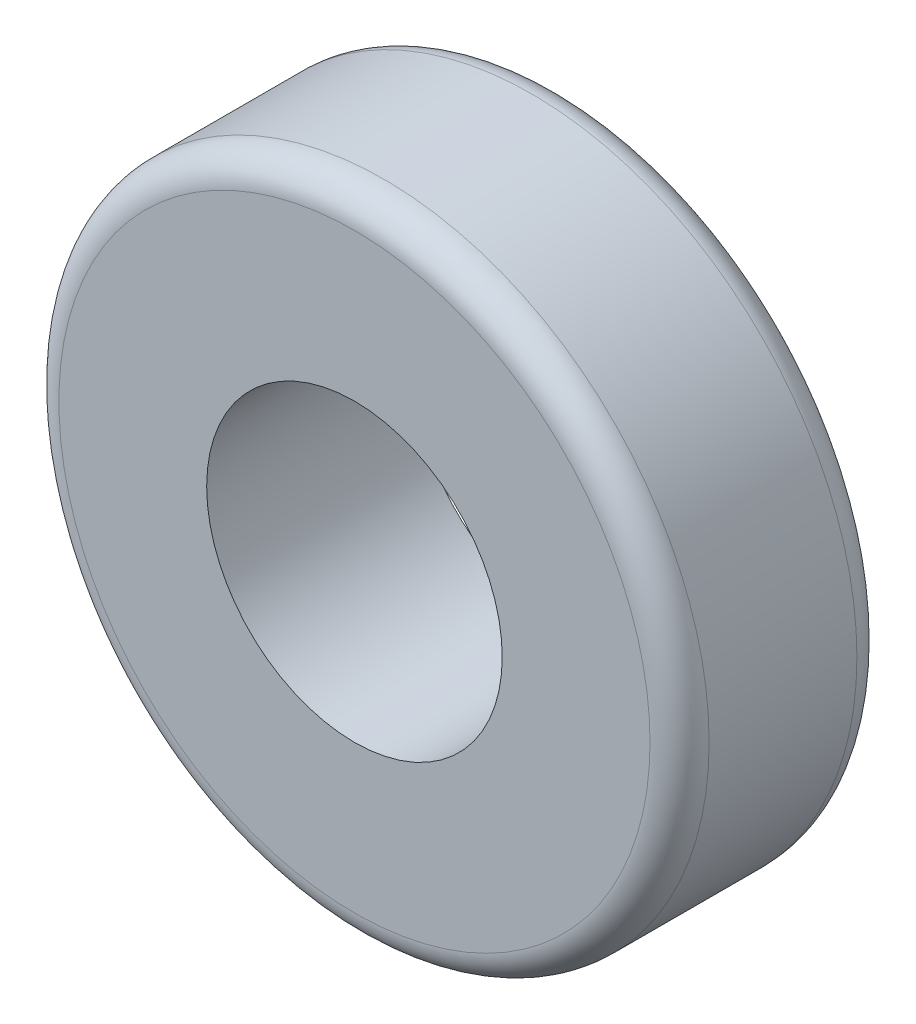
ISO-10303-21;
HEADER;
FILE_DESCRIPTION(('STEP AP214'),'2;1');
FILE_NAME('part.step','',(''),(''),'','','');
FILE_SCHEMA(('AUTOMOTIVE_DESIGN { 1 0 10303 214 1 1 1 1 }'));
ENDSEC;
DATA;
#1=APPLICATION_CONTEXT('core data for automotive mechanical design processes');
#2=APPLICATION_PROTOCOL_DEFINITION('international standard','automotive_design',2000,#1);
#3=PRODUCT_CONTEXT('',#1,'mechanical');
#4=PRODUCT('Part','Part','',(#3));
#5=PRODUCT_RELATED_PRODUCT_CATEGORY('part','',(#4));
#6=PRODUCT_DEFINITION_FORMATION('','',#4);
#7=PRODUCT_DEFINITION_CONTEXT('part definition',#1,'design');
#8=PRODUCT_DEFINITION('design','',#6,#7);
#9=PRODUCT_DEFINITION_SHAPE('','',#8);
#10=(LENGTH_UNIT() NAMED_UNIT(*) SI_UNIT(.MILLI.,.METRE.));
#11=(NAMED_UNIT(*) PLANE_ANGLE_UNIT() SI_UNIT($,.RADIAN.));
#12=(NAMED_UNIT(*) SI_UNIT($,.STERADIAN.) SOLID_ANGLE_UNIT());
#13=UNCERTAINTY_MEASURE_WITH_UNIT(LENGTH_MEASURE(1.E-05),#10,'distance_accuracy_value','');
#14=(GEOMETRIC_REPRESENTATION_CONTEXT(3) GLOBAL_UNCERTAINTY_ASSIGNED_CONTEXT((#13)) GLOBAL_UNIT_ASSIGNED_CONTEXT((#10,
#11,#12)) REPRESENTATION_CONTEXT('',''));
#15=CARTESIAN_POINT('',(0.,0.,0.));
#16=DIRECTION('',(0.,0.,1.));
#17=DIRECTION('',(1.,0.,0.));
#18=AXIS2_PLACEMENT_3D('',#15,#16,#17);
#19=CARTESIAN_POINT('',(0.,0.,7.));
#20=DIRECTION('',(0.,0.,1.));
#21=DIRECTION('',(1.,0.,0.));
#22=AXIS2_PLACEMENT_3D('',#19,#20,#21);
#23=PLANE('',#22);
#24=CARTESIAN_POINT('',(0.,0.,7.));
#25=DIRECTION('',(0.,0.,1.));
#26=DIRECTION('',(1.,0.,0.));
#27=AXIS2_PLACEMENT_3D('',#24,#25,#26);
#28=CIRCLE('',#27,10.);
#29=CARTESIAN_POINT('',(10.,0.,7.));
#30=VERTEX_POINT('',#29);
#31=EDGE_CURVE('E10',#30,#30,#28,.T.);
#32=ORIENTED_EDGE('',*,*,#31,.T.);
#33=EDGE_LOOP('',(#32));
#34=FACE_BOUND('',#33,.T.);
#35=CARTESIAN_POINT('',(0.,0.,7.));
#36=DIRECTION('',(0.,0.,1.));
#37=DIRECTION('',(1.,0.,0.));
#38=AXIS2_PLACEMENT_3D('',#35,#36,#37);
#39=CIRCLE('',#38,5.);
#40=CARTESIAN_POINT('',(5.,0.,7.));
#41=VERTEX_POINT('',#40);
#42=EDGE_CURVE('E57',#41,#41,#39,.T.);
#43=ORIENTED_EDGE('',*,*,#42,.F.);
#44=EDGE_LOOP('',(#43));
#45=FACE_BOUND('',#44,.T.);
#46=ADVANCED_FACE('F37',(#34,#45),#23,.T.);
#47=CARTESIAN_POINT('',(0.,0.,0.));
#48=DIRECTION('',(0.,0.,1.));
#49=DIRECTION('',(1.,0.,0.));
#50=AXIS2_PLACEMENT_3D('',#47,#48,#49);
#51=PLANE('',#50);
#52=CARTESIAN_POINT('',(0.,0.,0.));
#53=DIRECTION('',(0.,0.,1.));
#54=DIRECTION('',(1.,0.,0.));
#55=AXIS2_PLACEMENT_3D('',#52,#53,#54);
#56=CIRCLE('',#55,10.);
#57=CARTESIAN_POINT('',(10.,0.,0.));
#58=VERTEX_POINT('',#57);
#59=EDGE_CURVE('E44',#58,#58,#56,.F.);
#60=ORIENTED_EDGE('',*,*,#59,.T.);
#61=EDGE_LOOP('',(#60));
#62=FACE_BOUND('',#61,.T.);
#63=CARTESIAN_POINT('',(0.,0.,0.));
#64=DIRECTION('',(0.,0.,1.));
#65=DIRECTION('',(1.,0.,0.));
#66=AXIS2_PLACEMENT_3D('',#63,#64,#65);
#67=CIRCLE('',#66,5.);
#68=CARTESIAN_POINT('',(5.,0.,0.));
#69=VERTEX_POINT('',#68);
#70=EDGE_CURVE('E58',#69,#69,#67,.T.);
#71=ORIENTED_EDGE('',*,*,#70,.T.);
#72=EDGE_LOOP('',(#71));
#73=FACE_BOUND('',#72,.T.);
#74=ADVANCED_FACE('F68',(#62,#73),#51,.F.);
#75=CARTESIAN_POINT('',(0.,0.,7.));
#76=DIRECTION('',(0.,0.,-1.));
#77=DIRECTION('',(-1.,0.,0.));
#78=AXIS2_PLACEMENT_3D('',#75,#76,#77);
#79=CYLINDRICAL_SURFACE('',#78,11.);
#80=CARTESIAN_POINT('',(0.,0.,1.));
#81=DIRECTION('',(0.,0.,1.));
#82=DIRECTION('',(1.,0.,0.));
#83=AXIS2_PLACEMENT_3D('',#80,#81,#82);
#84=CIRCLE('',#83,11.);
#85=CARTESIAN_POINT('',(11.,0.,1.));
#86=VERTEX_POINT('',#85);
#87=EDGE_CURVE('E48',#86,#86,#84,.T.);
#88=ORIENTED_EDGE('',*,*,#87,.T.);
#89=EDGE_LOOP('',(#88));
#90=FACE_BOUND('',#89,.T.);
#91=CARTESIAN_POINT('',(0.,0.,6.));
#92=DIRECTION('',(0.,0.,1.));
#93=DIRECTION('',(1.,0.,0.));
#94=AXIS2_PLACEMENT_3D('',#91,#92,#93);
#95=CIRCLE('',#94,11.);
#96=CARTESIAN_POINT('',(11.,0.,6.));
#97=VERTEX_POINT('',#96);
#98=EDGE_CURVE('E52',#97,#97,#95,.F.);
#99=ORIENTED_EDGE('',*,*,#98,.T.);
#100=EDGE_LOOP('',(#99));
#101=FACE_BOUND('',#100,.T.);
#102=ADVANCED_FACE('F74',(#90,#101),#79,.T.);
#103=CARTESIAN_POINT('',(0.,0.,7.));
#104=DIRECTION('',(0.,0.,-1.));
#105=DIRECTION('',(-1.,0.,0.));
#106=AXIS2_PLACEMENT_3D('',#103,#104,#105);
#107=CYLINDRICAL_SURFACE('',#106,5.);
#108=ORIENTED_EDGE('',*,*,#42,.T.);
#109=EDGE_LOOP('',(#108));
#110=FACE_BOUND('',#109,.T.);
#111=ORIENTED_EDGE('',*,*,#70,.F.);
#112=EDGE_LOOP('',(#111));
#113=FACE_BOUND('',#112,.T.);
#114=ADVANCED_FACE('F64',(#110,#113),#107,.F.);
#115=CARTESIAN_POINT('',(0.,0.,1.));
#116=DIRECTION('',(0.,0.,1.));
#117=DIRECTION('',(1.,0.,0.));
#118=AXIS2_PLACEMENT_3D('',#115,#116,#117);
#119=TOROIDAL_SURFACE('',#118,10.,1.);
#120=ORIENTED_EDGE('',*,*,#59,.F.);
#121=EDGE_LOOP('',(#120));
#122=FACE_BOUND('',#121,.T.);
#123=ORIENTED_EDGE('',*,*,#87,.F.);
#124=EDGE_LOOP('',(#123));
#125=FACE_BOUND('',#124,.T.);
#126=ADVANCED_FACE('F80',(#122,#125),#119,.T.);
#127=CARTESIAN_POINT('',(0.,0.,6.));
#128=DIRECTION('',(0.,0.,1.));
#129=DIRECTION('',(1.,0.,0.));
#130=AXIS2_PLACEMENT_3D('',#127,#128,#129);
#131=TOROIDAL_SURFACE('',#130,10.,1.);
#132=ORIENTED_EDGE('',*,*,#98,.F.);
#133=EDGE_LOOP('',(#132));
#134=FACE_BOUND('',#133,.T.);
#135=ORIENTED_EDGE('',*,*,#31,.F.);
#136=EDGE_LOOP('',(#135));
#137=FACE_BOUND('',#136,.T.);
#138=ADVANCED_FACE('F39',(#134,#137),#131,.T.);
#139=CLOSED_SHELL('',(#46,#74,#102,#114,#126,#138));
#140=MANIFOLD_SOLID_BREP('B2',#139);
#141=ADVANCED_BREP_SHAPE_REPRESENTATION('',(#18,#140),#14);
#142=SHAPE_DEFINITION_REPRESENTATION(#9,#141);
ENDSEC;
END-ISO-10303-21;
